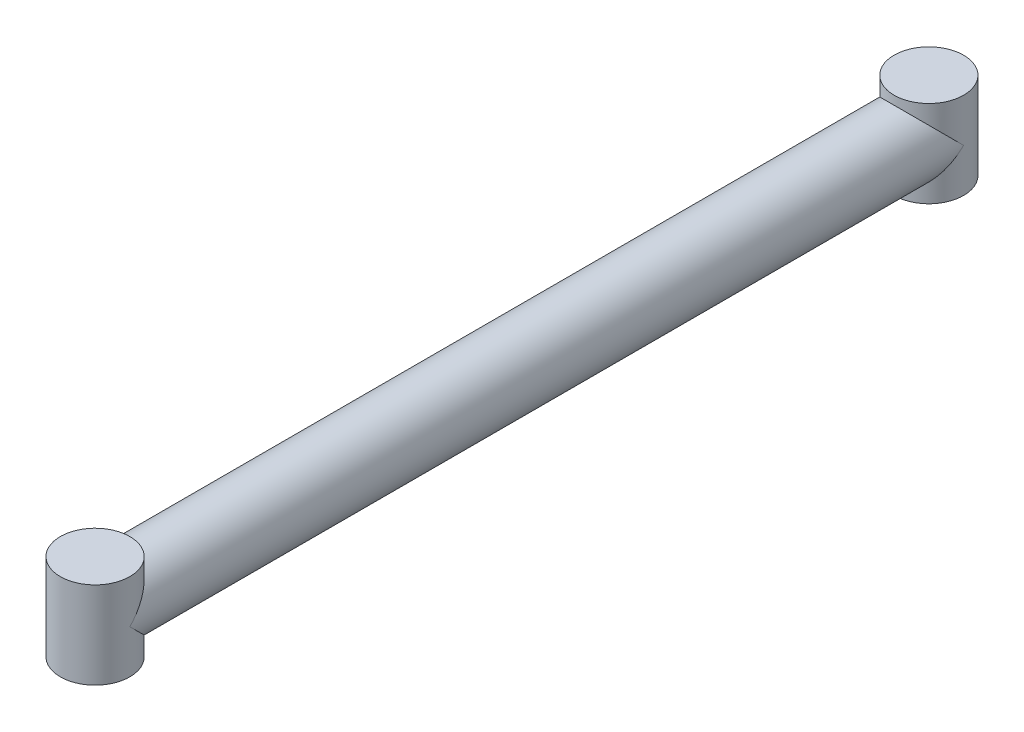
ISO-10303-21;
HEADER;
FILE_DESCRIPTION(('STEP AP214'),'2;1');
FILE_NAME('part.step','',(''),(''),'','','');
FILE_SCHEMA(('AUTOMOTIVE_DESIGN { 1 0 10303 214 1 1 1 1 }'));
ENDSEC;
DATA;
#1=APPLICATION_CONTEXT('core data for automotive mechanical design processes');
#2=APPLICATION_PROTOCOL_DEFINITION('international standard','automotive_design',2000,#1);
#3=PRODUCT_CONTEXT('',#1,'mechanical');
#4=PRODUCT('Part','Part','',(#3));
#5=PRODUCT_RELATED_PRODUCT_CATEGORY('part','',(#4));
#6=PRODUCT_DEFINITION_FORMATION('','',#4);
#7=PRODUCT_DEFINITION_CONTEXT('part definition',#1,'design');
#8=PRODUCT_DEFINITION('design','',#6,#7);
#9=PRODUCT_DEFINITION_SHAPE('','',#8);
#10=(LENGTH_UNIT() NAMED_UNIT(*) SI_UNIT(.MILLI.,.METRE.));
#11=(NAMED_UNIT(*) PLANE_ANGLE_UNIT() SI_UNIT($,.RADIAN.));
#12=(NAMED_UNIT(*) SI_UNIT($,.STERADIAN.) SOLID_ANGLE_UNIT());
#13=UNCERTAINTY_MEASURE_WITH_UNIT(LENGTH_MEASURE(1.E-05),#10,'distance_accuracy_value','');
#14=(GEOMETRIC_REPRESENTATION_CONTEXT(3) GLOBAL_UNCERTAINTY_ASSIGNED_CONTEXT((#13)) GLOBAL_UNIT_ASSIGNED_CONTEXT((#10,
#11,#12)) REPRESENTATION_CONTEXT('',''));
#15=CARTESIAN_POINT('',(0.,0.,0.));
#16=DIRECTION('',(0.,0.,1.));
#17=DIRECTION('',(1.,0.,0.));
#18=AXIS2_PLACEMENT_3D('',#15,#16,#17);
#19=CARTESIAN_POINT('',(0.,0.,240.));
#20=DIRECTION('',(0.,0.,-1.));
#21=DIRECTION('',(-1.,0.,0.));
#22=AXIS2_PLACEMENT_3D('',#19,#20,#21);
#23=CYLINDRICAL_SURFACE('',#22,10.);
#24=CARTESIAN_POINT('',(0.,0.,0.));
#25=DIRECTION('',(0.,-0.707106781186547,-0.707106781186547));
#26=DIRECTION('',(0.,0.707106781186547,-0.707106781186547));
#27=AXIS2_PLACEMENT_3D('',#24,#25,#26);
#28=ELLIPSE('',#27,14.1421356237309,10.);
#29=CARTESIAN_POINT('',(10.,0.,0.));
#30=VERTEX_POINT('',#29);
#31=CARTESIAN_POINT('',(-10.,0.,0.));
#32=VERTEX_POINT('',#31);
#33=EDGE_CURVE('E11',#30,#32,#28,.T.);
#34=ORIENTED_EDGE('',*,*,#33,.F.);
#35=CARTESIAN_POINT('',(0.,0.,0.));
#36=DIRECTION('',(0.,0.707106781186547,-0.707106781186547));
#37=DIRECTION('',(0.,-0.707106781186547,-0.707106781186547));
#38=AXIS2_PLACEMENT_3D('',#35,#36,#37);
#39=ELLIPSE('',#38,14.1421356237309,10.);
#40=EDGE_CURVE('E51',#32,#30,#39,.T.);
#41=ORIENTED_EDGE('',*,*,#40,.F.);
#42=EDGE_LOOP('',(#34,#41));
#43=FACE_BOUND('',#42,.T.);
#44=CARTESIAN_POINT('',(0.,0.,240.));
#45=DIRECTION('',(0.,-0.707106781186547,-0.707106781186547));
#46=DIRECTION('',(0.,0.707106781186547,-0.707106781186547));
#47=AXIS2_PLACEMENT_3D('',#44,#45,#46);
#48=ELLIPSE('',#47,14.1421356237309,10.);
#49=CARTESIAN_POINT('',(10.,0.,240.));
#50=VERTEX_POINT('',#49);
#51=CARTESIAN_POINT('',(-10.,0.,240.));
#52=VERTEX_POINT('',#51);
#53=EDGE_CURVE('E67',#50,#52,#48,.F.);
#54=ORIENTED_EDGE('',*,*,#53,.F.);
#55=CARTESIAN_POINT('',(0.,0.,240.));
#56=DIRECTION('',(0.,0.707106781186547,-0.707106781186547));
#57=DIRECTION('',(0.,-0.707106781186547,-0.707106781186547));
#58=AXIS2_PLACEMENT_3D('',#55,#56,#57);
#59=ELLIPSE('',#58,14.1421356237309,10.);
#60=EDGE_CURVE('E57',#52,#50,#59,.F.);
#61=ORIENTED_EDGE('',*,*,#60,.F.);
#62=EDGE_LOOP('',(#54,#61));
#63=FACE_BOUND('',#62,.T.);
#64=ADVANCED_FACE('F43',(#43,#63),#23,.T.);
#65=CARTESIAN_POINT('',(0.,12.5,0.));
#66=DIRECTION('',(0.,-1.,0.));
#67=DIRECTION('',(0.,0.,-1.));
#68=AXIS2_PLACEMENT_3D('',#65,#66,#67);
#69=CYLINDRICAL_SURFACE('',#68,10.);
#70=CARTESIAN_POINT('',(0.,12.5,0.));
#71=DIRECTION('',(0.,1.,0.));
#72=DIRECTION('',(0.,0.,1.));
#73=AXIS2_PLACEMENT_3D('',#70,#71,#72);
#74=CIRCLE('',#73,10.);
#75=CARTESIAN_POINT('',(0.,12.5,10.));
#76=VERTEX_POINT('',#75);
#77=EDGE_CURVE('E85',#76,#76,#74,.T.);
#78=ORIENTED_EDGE('',*,*,#77,.F.);
#79=EDGE_LOOP('',(#78));
#80=FACE_BOUND('',#79,.T.);
#81=CARTESIAN_POINT('',(0.,-12.5,0.));
#82=DIRECTION('',(0.,1.,0.));
#83=DIRECTION('',(0.,0.,1.));
#84=AXIS2_PLACEMENT_3D('',#81,#82,#83);
#85=CIRCLE('',#84,10.);
#86=CARTESIAN_POINT('',(0.,-12.5,10.));
#87=VERTEX_POINT('',#86);
#88=EDGE_CURVE('E70',#87,#87,#85,.T.);
#89=ORIENTED_EDGE('',*,*,#88,.T.);
#90=EDGE_LOOP('',(#89));
#91=FACE_BOUND('',#90,.T.);
#92=ORIENTED_EDGE('',*,*,#40,.T.);
#93=ORIENTED_EDGE('',*,*,#33,.T.);
#94=EDGE_LOOP('',(#92,#93));
#95=FACE_BOUND('',#94,.T.);
#96=ADVANCED_FACE('F90',(#80,#91,#95),#69,.T.);
#97=CARTESIAN_POINT('',(0.,12.5,0.));
#98=DIRECTION('',(0.,1.,0.));
#99=DIRECTION('',(0.,0.,1.));
#100=AXIS2_PLACEMENT_3D('',#97,#98,#99);
#101=PLANE('',#100);
#102=ORIENTED_EDGE('',*,*,#77,.T.);
#103=EDGE_LOOP('',(#102));
#104=FACE_BOUND('',#103,.T.);
#105=ADVANCED_FACE('F95',(#104),#101,.T.);
#106=CARTESIAN_POINT('',(0.,-12.5,0.));
#107=DIRECTION('',(0.,1.,0.));
#108=DIRECTION('',(0.,0.,1.));
#109=AXIS2_PLACEMENT_3D('',#106,#107,#108);
#110=PLANE('',#109);
#111=ORIENTED_EDGE('',*,*,#88,.F.);
#112=EDGE_LOOP('',(#111));
#113=FACE_BOUND('',#112,.T.);
#114=ADVANCED_FACE('F100',(#113),#110,.F.);
#115=CARTESIAN_POINT('',(0.,12.5,240.));
#116=DIRECTION('',(0.,-1.,0.));
#117=DIRECTION('',(0.,0.,-1.));
#118=AXIS2_PLACEMENT_3D('',#115,#116,#117);
#119=CYLINDRICAL_SURFACE('',#118,10.);
#120=CARTESIAN_POINT('',(0.,12.5,240.));
#121=DIRECTION('',(0.,1.,0.));
#122=DIRECTION('',(0.,0.,1.));
#123=AXIS2_PLACEMENT_3D('',#120,#121,#122);
#124=CIRCLE('',#123,10.);
#125=CARTESIAN_POINT('',(0.,12.5,250.));
#126=VERTEX_POINT('',#125);
#127=EDGE_CURVE('E78',#126,#126,#124,.T.);
#128=ORIENTED_EDGE('',*,*,#127,.F.);
#129=EDGE_LOOP('',(#128));
#130=FACE_BOUND('',#129,.T.);
#131=CARTESIAN_POINT('',(0.,-12.5,240.));
#132=DIRECTION('',(0.,1.,0.));
#133=DIRECTION('',(0.,0.,1.));
#134=AXIS2_PLACEMENT_3D('',#131,#132,#133);
#135=CIRCLE('',#134,10.);
#136=CARTESIAN_POINT('',(0.,-12.5,250.));
#137=VERTEX_POINT('',#136);
#138=EDGE_CURVE('E74',#137,#137,#135,.T.);
#139=ORIENTED_EDGE('',*,*,#138,.T.);
#140=EDGE_LOOP('',(#139));
#141=FACE_BOUND('',#140,.T.);
#142=ORIENTED_EDGE('',*,*,#60,.T.);
#143=ORIENTED_EDGE('',*,*,#53,.T.);
#144=EDGE_LOOP('',(#142,#143));
#145=FACE_BOUND('',#144,.T.);
#146=ADVANCED_FACE('F72',(#130,#141,#145),#119,.T.);
#147=CARTESIAN_POINT('',(0.,12.5,240.));
#148=DIRECTION('',(0.,1.,0.));
#149=DIRECTION('',(0.,0.,1.));
#150=AXIS2_PLACEMENT_3D('',#147,#148,#149);
#151=PLANE('',#150);
#152=ORIENTED_EDGE('',*,*,#127,.T.);
#153=EDGE_LOOP('',(#152));
#154=FACE_BOUND('',#153,.T.);
#155=ADVANCED_FACE('F112',(#154),#151,.T.);
#156=CARTESIAN_POINT('',(0.,-12.5,240.));
#157=DIRECTION('',(0.,1.,0.));
#158=DIRECTION('',(0.,0.,1.));
#159=AXIS2_PLACEMENT_3D('',#156,#157,#158);
#160=PLANE('',#159);
#161=ORIENTED_EDGE('',*,*,#138,.F.);
#162=EDGE_LOOP('',(#161));
#163=FACE_BOUND('',#162,.T.);
#164=ADVANCED_FACE('F109',(#163),#160,.F.);
#165=CLOSED_SHELL('',(#64,#96,#105,#114,#146,#155,#164));
#166=MANIFOLD_SOLID_BREP('B2',#165);
#167=ADVANCED_BREP_SHAPE_REPRESENTATION('',(#18,#166),#14);
#168=SHAPE_DEFINITION_REPRESENTATION(#9,#167);
ENDSEC;
END-ISO-10303-21;
